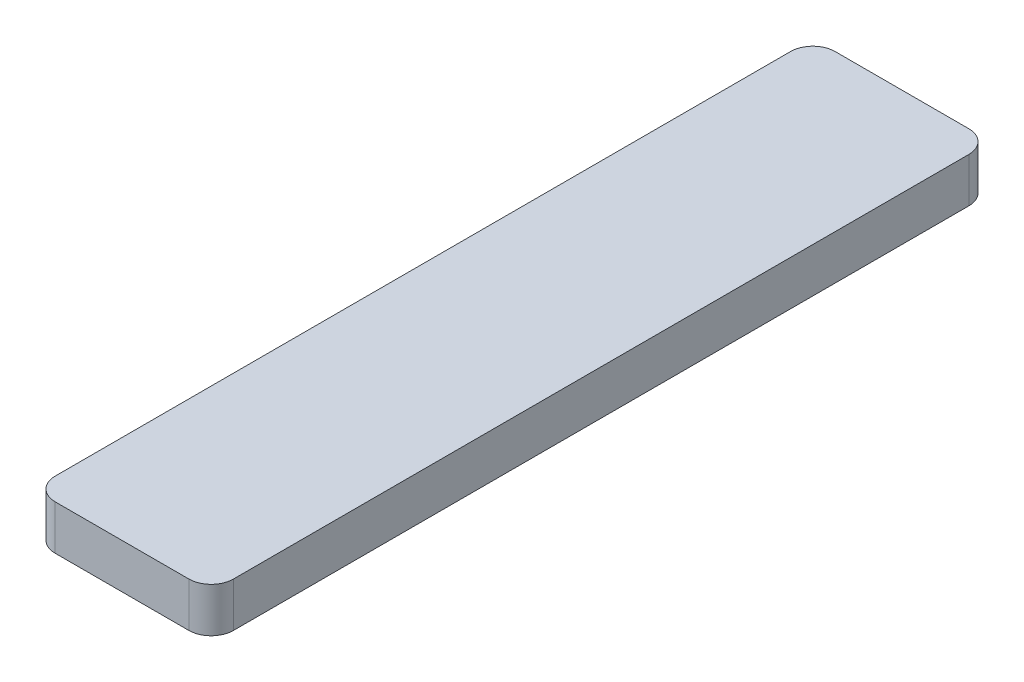
ISO-10303-21;
HEADER;
FILE_DESCRIPTION(('STEP AP214'),'2;1');
FILE_NAME('part.step','',(''),(''),'','','');
FILE_SCHEMA(('AUTOMOTIVE_DESIGN { 1 0 10303 214 1 1 1 1 }'));
ENDSEC;
DATA;
#1=APPLICATION_CONTEXT('core data for automotive mechanical design processes');
#2=APPLICATION_PROTOCOL_DEFINITION('international standard','automotive_design',2000,#1);
#3=PRODUCT_CONTEXT('',#1,'mechanical');
#4=PRODUCT('Part','Part','',(#3));
#5=PRODUCT_RELATED_PRODUCT_CATEGORY('part','',(#4));
#6=PRODUCT_DEFINITION_FORMATION('','',#4);
#7=PRODUCT_DEFINITION_CONTEXT('part definition',#1,'design');
#8=PRODUCT_DEFINITION('design','',#6,#7);
#9=PRODUCT_DEFINITION_SHAPE('','',#8);
#10=(LENGTH_UNIT() NAMED_UNIT(*) SI_UNIT(.MILLI.,.METRE.));
#11=(NAMED_UNIT(*) PLANE_ANGLE_UNIT() SI_UNIT($,.RADIAN.));
#12=(NAMED_UNIT(*) SI_UNIT($,.STERADIAN.) SOLID_ANGLE_UNIT());
#13=UNCERTAINTY_MEASURE_WITH_UNIT(LENGTH_MEASURE(1.E-05),#10,'distance_accuracy_value','');
#14=(GEOMETRIC_REPRESENTATION_CONTEXT(3) GLOBAL_UNCERTAINTY_ASSIGNED_CONTEXT((#13)) GLOBAL_UNIT_ASSIGNED_CONTEXT((#10,
#11,#12)) REPRESENTATION_CONTEXT('',''));
#15=CARTESIAN_POINT('',(0.,0.,0.));
#16=DIRECTION('',(0.,0.,1.));
#17=DIRECTION('',(1.,0.,0.));
#18=AXIS2_PLACEMENT_3D('',#15,#16,#17);
#19=CARTESIAN_POINT('',(-8.,4.,35.));
#20=DIRECTION('',(1.,0.,0.));
#21=DIRECTION('',(0.,0.,-1.));
#22=AXIS2_PLACEMENT_3D('',#19,#20,#21);
#23=PLANE('',#22);
#24=DIRECTION('',(0.,0.,1.));
#25=VECTOR('',#24,1.);
#26=CARTESIAN_POINT('',(-8.,0.,35.));
#27=LINE('',#26,#25);
#28=CARTESIAN_POINT('',(-8.,0.,-33.));
#29=VERTEX_POINT('',#28);
#30=CARTESIAN_POINT('',(-8.,0.,33.));
#31=VERTEX_POINT('',#30);
#32=EDGE_CURVE('E128',#29,#31,#27,.T.);
#33=ORIENTED_EDGE('',*,*,#32,.T.);
#34=DIRECTION('',(0.,-1.,0.));
#35=VECTOR('',#34,1.);
#36=CARTESIAN_POINT('',(-8.,4.,33.));
#37=LINE('',#36,#35);
#38=CARTESIAN_POINT('',(-8.,4.,33.));
#39=VERTEX_POINT('',#38);
#40=EDGE_CURVE('E106',#31,#39,#37,.F.);
#41=ORIENTED_EDGE('',*,*,#40,.T.);
#42=DIRECTION('',(0.,0.,1.));
#43=VECTOR('',#42,1.);
#44=CARTESIAN_POINT('',(-8.,4.,35.));
#45=LINE('',#44,#43);
#46=CARTESIAN_POINT('',(-8.,4.,-33.));
#47=VERTEX_POINT('',#46);
#48=EDGE_CURVE('E137',#47,#39,#45,.T.);
#49=ORIENTED_EDGE('',*,*,#48,.F.);
#50=DIRECTION('',(0.,-1.,0.));
#51=VECTOR('',#50,1.);
#52=CARTESIAN_POINT('',(-8.,4.,-33.));
#53=LINE('',#52,#51);
#54=EDGE_CURVE('E111',#47,#29,#53,.T.);
#55=ORIENTED_EDGE('',*,*,#54,.T.);
#56=EDGE_LOOP('',(#33,#41,#49,#55));
#57=FACE_BOUND('',#56,.T.);
#58=ADVANCED_FACE('F35',(#57),#23,.F.);
#59=CARTESIAN_POINT('',(8.,4.,35.));
#60=DIRECTION('',(0.,0.,-1.));
#61=DIRECTION('',(-1.,0.,0.));
#62=AXIS2_PLACEMENT_3D('',#59,#60,#61);
#63=PLANE('',#62);
#64=DIRECTION('',(1.,0.,0.));
#65=VECTOR('',#64,1.);
#66=CARTESIAN_POINT('',(8.,4.,35.));
#67=LINE('',#66,#65);
#68=CARTESIAN_POINT('',(-6.,4.,35.));
#69=VERTEX_POINT('',#68);
#70=CARTESIAN_POINT('',(6.,4.,35.));
#71=VERTEX_POINT('',#70);
#72=EDGE_CURVE('E121',#69,#71,#67,.T.);
#73=ORIENTED_EDGE('',*,*,#72,.F.);
#74=DIRECTION('',(0.,-1.,0.));
#75=VECTOR('',#74,1.);
#76=CARTESIAN_POINT('',(-6.,4.,35.));
#77=LINE('',#76,#75);
#78=CARTESIAN_POINT('',(-6.,0.,35.));
#79=VERTEX_POINT('',#78);
#80=EDGE_CURVE('E105',#69,#79,#77,.T.);
#81=ORIENTED_EDGE('',*,*,#80,.T.);
#82=DIRECTION('',(1.,0.,0.));
#83=VECTOR('',#82,1.);
#84=CARTESIAN_POINT('',(8.,0.,35.));
#85=LINE('',#84,#83);
#86=CARTESIAN_POINT('',(6.,0.,35.));
#87=VERTEX_POINT('',#86);
#88=EDGE_CURVE('E118',#79,#87,#85,.T.);
#89=ORIENTED_EDGE('',*,*,#88,.T.);
#90=DIRECTION('',(0.,-1.,0.));
#91=VECTOR('',#90,1.);
#92=CARTESIAN_POINT('',(6.,4.,35.));
#93=LINE('',#92,#91);
#94=EDGE_CURVE('E123',#87,#71,#93,.F.);
#95=ORIENTED_EDGE('',*,*,#94,.T.);
#96=EDGE_LOOP('',(#73,#81,#89,#95));
#97=FACE_BOUND('',#96,.T.);
#98=ADVANCED_FACE('F117',(#97),#63,.F.);
#99=CARTESIAN_POINT('',(8.,4.,35.));
#100=DIRECTION('',(-1.,0.,0.));
#101=DIRECTION('',(0.,0.,1.));
#102=AXIS2_PLACEMENT_3D('',#99,#100,#101);
#103=PLANE('',#102);
#104=DIRECTION('',(0.,0.,-1.));
#105=VECTOR('',#104,1.);
#106=CARTESIAN_POINT('',(8.,4.,35.));
#107=LINE('',#106,#105);
#108=CARTESIAN_POINT('',(8.,4.,33.));
#109=VERTEX_POINT('',#108);
#110=CARTESIAN_POINT('',(8.,4.,-33.));
#111=VERTEX_POINT('',#110);
#112=EDGE_CURVE('E163',#109,#111,#107,.T.);
#113=ORIENTED_EDGE('',*,*,#112,.F.);
#114=DIRECTION('',(0.,-1.,0.));
#115=VECTOR('',#114,1.);
#116=CARTESIAN_POINT('',(8.,4.,33.));
#117=LINE('',#116,#115);
#118=CARTESIAN_POINT('',(8.,0.,33.));
#119=VERTEX_POINT('',#118);
#120=EDGE_CURVE('E156',#109,#119,#117,.T.);
#121=ORIENTED_EDGE('',*,*,#120,.T.);
#122=DIRECTION('',(0.,0.,-1.));
#123=VECTOR('',#122,1.);
#124=CARTESIAN_POINT('',(8.,0.,35.));
#125=LINE('',#124,#123);
#126=CARTESIAN_POINT('',(8.,0.,-33.));
#127=VERTEX_POINT('',#126);
#128=EDGE_CURVE('E127',#119,#127,#125,.T.);
#129=ORIENTED_EDGE('',*,*,#128,.T.);
#130=DIRECTION('',(0.,-1.,0.));
#131=VECTOR('',#130,1.);
#132=CARTESIAN_POINT('',(8.,4.,-33.));
#133=LINE('',#132,#131);
#134=EDGE_CURVE('E154',#127,#111,#133,.F.);
#135=ORIENTED_EDGE('',*,*,#134,.T.);
#136=EDGE_LOOP('',(#113,#121,#129,#135));
#137=FACE_BOUND('',#136,.T.);
#138=ADVANCED_FACE('F161',(#137),#103,.F.);
#139=CARTESIAN_POINT('',(8.,4.,-35.));
#140=DIRECTION('',(0.,0.,1.));
#141=DIRECTION('',(1.,0.,0.));
#142=AXIS2_PLACEMENT_3D('',#139,#140,#141);
#143=PLANE('',#142);
#144=DIRECTION('',(-1.,0.,0.));
#145=VECTOR('',#144,1.);
#146=CARTESIAN_POINT('',(8.,4.,-35.));
#147=LINE('',#146,#145);
#148=CARTESIAN_POINT('',(6.,4.,-35.));
#149=VERTEX_POINT('',#148);
#150=CARTESIAN_POINT('',(-6.,4.,-35.));
#151=VERTEX_POINT('',#150);
#152=EDGE_CURVE('E138',#149,#151,#147,.T.);
#153=ORIENTED_EDGE('',*,*,#152,.F.);
#154=DIRECTION('',(0.,-1.,0.));
#155=VECTOR('',#154,1.);
#156=CARTESIAN_POINT('',(6.,4.,-35.));
#157=LINE('',#156,#155);
#158=CARTESIAN_POINT('',(6.,0.,-35.));
#159=VERTEX_POINT('',#158);
#160=EDGE_CURVE('E11',#149,#159,#157,.T.);
#161=ORIENTED_EDGE('',*,*,#160,.T.);
#162=DIRECTION('',(-1.,0.,0.));
#163=VECTOR('',#162,1.);
#164=CARTESIAN_POINT('',(8.,0.,-35.));
#165=LINE('',#164,#163);
#166=CARTESIAN_POINT('',(-6.,0.,-35.));
#167=VERTEX_POINT('',#166);
#168=EDGE_CURVE('E131',#159,#167,#165,.T.);
#169=ORIENTED_EDGE('',*,*,#168,.T.);
#170=DIRECTION('',(0.,-1.,0.));
#171=VECTOR('',#170,1.);
#172=CARTESIAN_POINT('',(-6.,4.,-35.));
#173=LINE('',#172,#171);
#174=EDGE_CURVE('E43',#167,#151,#173,.F.);
#175=ORIENTED_EDGE('',*,*,#174,.T.);
#176=EDGE_LOOP('',(#153,#161,#169,#175));
#177=FACE_BOUND('',#176,.T.);
#178=ADVANCED_FACE('F170',(#177),#143,.F.);
#179=CARTESIAN_POINT('',(0.,4.,0.));
#180=DIRECTION('',(0.,1.,0.));
#181=DIRECTION('',(0.,0.,1.));
#182=AXIS2_PLACEMENT_3D('',#179,#180,#181);
#183=PLANE('',#182);
#184=ORIENTED_EDGE('',*,*,#48,.T.);
#185=CARTESIAN_POINT('',(-6.,4.,33.));
#186=DIRECTION('',(0.,1.,0.));
#187=DIRECTION('',(0.,0.,1.));
#188=AXIS2_PLACEMENT_3D('',#185,#186,#187);
#189=CIRCLE('',#188,2.);
#190=EDGE_CURVE('E152',#39,#69,#189,.T.);
#191=ORIENTED_EDGE('',*,*,#190,.T.);
#192=ORIENTED_EDGE('',*,*,#72,.T.);
#193=CARTESIAN_POINT('',(6.,4.,33.));
#194=DIRECTION('',(0.,1.,0.));
#195=DIRECTION('',(0.,0.,1.));
#196=AXIS2_PLACEMENT_3D('',#193,#194,#195);
#197=CIRCLE('',#196,2.);
#198=EDGE_CURVE('E150',#71,#109,#197,.T.);
#199=ORIENTED_EDGE('',*,*,#198,.T.);
#200=ORIENTED_EDGE('',*,*,#112,.T.);
#201=CARTESIAN_POINT('',(6.,4.,-33.));
#202=DIRECTION('',(0.,1.,0.));
#203=DIRECTION('',(0.,0.,1.));
#204=AXIS2_PLACEMENT_3D('',#201,#202,#203);
#205=CIRCLE('',#204,2.);
#206=EDGE_CURVE('E56',#111,#149,#205,.T.);
#207=ORIENTED_EDGE('',*,*,#206,.T.);
#208=ORIENTED_EDGE('',*,*,#152,.T.);
#209=CARTESIAN_POINT('',(-6.,4.,-33.));
#210=DIRECTION('',(0.,1.,0.));
#211=DIRECTION('',(0.,0.,1.));
#212=AXIS2_PLACEMENT_3D('',#209,#210,#211);
#213=CIRCLE('',#212,2.);
#214=EDGE_CURVE('E147',#151,#47,#213,.T.);
#215=ORIENTED_EDGE('',*,*,#214,.T.);
#216=EDGE_LOOP('',(#184,#191,#192,#199,#200,#207,#208,#215));
#217=FACE_BOUND('',#216,.T.);
#218=ADVANCED_FACE('F177',(#217),#183,.T.);
#219=CARTESIAN_POINT('',(0.,0.,0.));
#220=DIRECTION('',(0.,1.,0.));
#221=DIRECTION('',(0.,0.,1.));
#222=AXIS2_PLACEMENT_3D('',#219,#220,#221);
#223=PLANE('',#222);
#224=ORIENTED_EDGE('',*,*,#88,.F.);
#225=CARTESIAN_POINT('',(-6.,0.,33.));
#226=DIRECTION('',(0.,1.,0.));
#227=DIRECTION('',(0.,0.,1.));
#228=AXIS2_PLACEMENT_3D('',#225,#226,#227);
#229=CIRCLE('',#228,2.);
#230=EDGE_CURVE('E101',#79,#31,#229,.F.);
#231=ORIENTED_EDGE('',*,*,#230,.T.);
#232=ORIENTED_EDGE('',*,*,#32,.F.);
#233=CARTESIAN_POINT('',(-6.,0.,-33.));
#234=DIRECTION('',(0.,1.,0.));
#235=DIRECTION('',(0.,0.,1.));
#236=AXIS2_PLACEMENT_3D('',#233,#234,#235);
#237=CIRCLE('',#236,2.);
#238=EDGE_CURVE('E122',#29,#167,#237,.F.);
#239=ORIENTED_EDGE('',*,*,#238,.T.);
#240=ORIENTED_EDGE('',*,*,#168,.F.);
#241=CARTESIAN_POINT('',(6.,0.,-33.));
#242=DIRECTION('',(0.,1.,0.));
#243=DIRECTION('',(0.,0.,1.));
#244=AXIS2_PLACEMENT_3D('',#241,#242,#243);
#245=CIRCLE('',#244,2.);
#246=EDGE_CURVE('E141',#159,#127,#245,.F.);
#247=ORIENTED_EDGE('',*,*,#246,.T.);
#248=ORIENTED_EDGE('',*,*,#128,.F.);
#249=CARTESIAN_POINT('',(6.,0.,33.));
#250=DIRECTION('',(0.,1.,0.));
#251=DIRECTION('',(0.,0.,1.));
#252=AXIS2_PLACEMENT_3D('',#249,#250,#251);
#253=CIRCLE('',#252,2.);
#254=EDGE_CURVE('E112',#119,#87,#253,.F.);
#255=ORIENTED_EDGE('',*,*,#254,.T.);
#256=EDGE_LOOP('',(#224,#231,#232,#239,#240,#247,#248,#255));
#257=FACE_BOUND('',#256,.T.);
#258=ADVANCED_FACE('F125',(#257),#223,.F.);
#259=CARTESIAN_POINT('',(-6.,4.,33.));
#260=DIRECTION('',(0.,-1.,0.));
#261=DIRECTION('',(0.,0.,-1.));
#262=AXIS2_PLACEMENT_3D('',#259,#260,#261);
#263=CYLINDRICAL_SURFACE('',#262,2.);
#264=ORIENTED_EDGE('',*,*,#190,.F.);
#265=ORIENTED_EDGE('',*,*,#40,.F.);
#266=ORIENTED_EDGE('',*,*,#230,.F.);
#267=ORIENTED_EDGE('',*,*,#80,.F.);
#268=EDGE_LOOP('',(#264,#265,#266,#267));
#269=FACE_BOUND('',#268,.T.);
#270=ADVANCED_FACE('F104',(#269),#263,.T.);
#271=CARTESIAN_POINT('',(6.,4.,33.));
#272=DIRECTION('',(0.,-1.,0.));
#273=DIRECTION('',(0.,0.,-1.));
#274=AXIS2_PLACEMENT_3D('',#271,#272,#273);
#275=CYLINDRICAL_SURFACE('',#274,2.);
#276=ORIENTED_EDGE('',*,*,#198,.F.);
#277=ORIENTED_EDGE('',*,*,#94,.F.);
#278=ORIENTED_EDGE('',*,*,#254,.F.);
#279=ORIENTED_EDGE('',*,*,#120,.F.);
#280=EDGE_LOOP('',(#276,#277,#278,#279));
#281=FACE_BOUND('',#280,.T.);
#282=ADVANCED_FACE('F185',(#281),#275,.T.);
#283=CARTESIAN_POINT('',(6.,4.,-33.));
#284=DIRECTION('',(0.,-1.,0.));
#285=DIRECTION('',(0.,0.,-1.));
#286=AXIS2_PLACEMENT_3D('',#283,#284,#285);
#287=CYLINDRICAL_SURFACE('',#286,2.);
#288=ORIENTED_EDGE('',*,*,#206,.F.);
#289=ORIENTED_EDGE('',*,*,#134,.F.);
#290=ORIENTED_EDGE('',*,*,#246,.F.);
#291=ORIENTED_EDGE('',*,*,#160,.F.);
#292=EDGE_LOOP('',(#288,#289,#290,#291));
#293=FACE_BOUND('',#292,.T.);
#294=ADVANCED_FACE('F169',(#293),#287,.T.);
#295=CARTESIAN_POINT('',(-6.,4.,-33.));
#296=DIRECTION('',(0.,-1.,0.));
#297=DIRECTION('',(0.,0.,-1.));
#298=AXIS2_PLACEMENT_3D('',#295,#296,#297);
#299=CYLINDRICAL_SURFACE('',#298,2.);
#300=ORIENTED_EDGE('',*,*,#214,.F.);
#301=ORIENTED_EDGE('',*,*,#174,.F.);
#302=ORIENTED_EDGE('',*,*,#238,.F.);
#303=ORIENTED_EDGE('',*,*,#54,.F.);
#304=EDGE_LOOP('',(#300,#301,#302,#303));
#305=FACE_BOUND('',#304,.T.);
#306=ADVANCED_FACE('F37',(#305),#299,.T.);
#307=CLOSED_SHELL('',(#58,#98,#138,#178,#218,#258,#270,#282,#294,#306));
#308=MANIFOLD_SOLID_BREP('B2',#307);
#309=ADVANCED_BREP_SHAPE_REPRESENTATION('',(#18,#308),#14);
#310=SHAPE_DEFINITION_REPRESENTATION(#9,#309);
ENDSEC;
END-ISO-10303-21;
